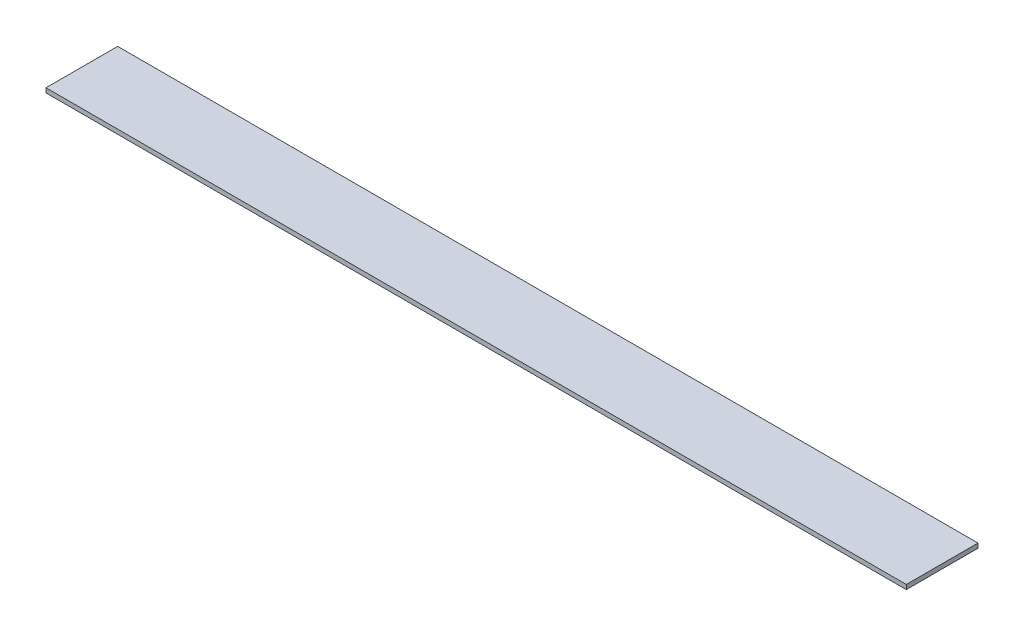
ISO-10303-21;
HEADER;
FILE_DESCRIPTION(('STEP AP214'),'2;1');
FILE_NAME('part.step','',(''),(''),'','','');
FILE_SCHEMA(('AUTOMOTIVE_DESIGN { 1 0 10303 214 1 1 1 1 }'));
ENDSEC;
DATA;
#1=APPLICATION_CONTEXT('core data for automotive mechanical design processes');
#2=APPLICATION_PROTOCOL_DEFINITION('international standard','automotive_design',2000,#1);
#3=PRODUCT_CONTEXT('',#1,'mechanical');
#4=PRODUCT('Part','Part','',(#3));
#5=PRODUCT_RELATED_PRODUCT_CATEGORY('part','',(#4));
#6=PRODUCT_DEFINITION_FORMATION('','',#4);
#7=PRODUCT_DEFINITION_CONTEXT('part definition',#1,'design');
#8=PRODUCT_DEFINITION('design','',#6,#7);
#9=PRODUCT_DEFINITION_SHAPE('','',#8);
#10=(LENGTH_UNIT() NAMED_UNIT(*) SI_UNIT(.MILLI.,.METRE.));
#11=(NAMED_UNIT(*) PLANE_ANGLE_UNIT() SI_UNIT($,.RADIAN.));
#12=(NAMED_UNIT(*) SI_UNIT($,.STERADIAN.) SOLID_ANGLE_UNIT());
#13=UNCERTAINTY_MEASURE_WITH_UNIT(LENGTH_MEASURE(1.E-05),#10,'distance_accuracy_value','');
#14=(GEOMETRIC_REPRESENTATION_CONTEXT(3) GLOBAL_UNCERTAINTY_ASSIGNED_CONTEXT((#13)) GLOBAL_UNIT_ASSIGNED_CONTEXT((#10,
#11,#12)) REPRESENTATION_CONTEXT('',''));
#15=CARTESIAN_POINT('',(0.,0.,0.));
#16=DIRECTION('',(0.,0.,1.));
#17=DIRECTION('',(1.,0.,0.));
#18=AXIS2_PLACEMENT_3D('',#15,#16,#17);
#19=CARTESIAN_POINT('',(0.,1.5875,0.));
#20=DIRECTION('',(1.,0.,0.));
#21=DIRECTION('',(0.,0.,-1.));
#22=AXIS2_PLACEMENT_3D('',#19,#20,#21);
#23=PLANE('',#22);
#24=DIRECTION('',(0.,0.,1.));
#25=VECTOR('',#24,1.);
#26=CARTESIAN_POINT('',(0.,0.,0.));
#27=LINE('',#26,#25);
#28=CARTESIAN_POINT('',(0.,0.,-25.4));
#29=VERTEX_POINT('',#28);
#30=CARTESIAN_POINT('',(0.,0.,0.));
#31=VERTEX_POINT('',#30);
#32=EDGE_CURVE('E100',#29,#31,#27,.T.);
#33=ORIENTED_EDGE('',*,*,#32,.T.);
#34=DIRECTION('',(0.,-1.,0.));
#35=VECTOR('',#34,1.);
#36=CARTESIAN_POINT('',(0.,1.5875,0.));
#37=LINE('',#36,#35);
#38=CARTESIAN_POINT('',(0.,1.5875,0.));
#39=VERTEX_POINT('',#38);
#40=EDGE_CURVE('E11',#39,#31,#37,.T.);
#41=ORIENTED_EDGE('',*,*,#40,.F.);
#42=DIRECTION('',(0.,0.,1.));
#43=VECTOR('',#42,1.);
#44=CARTESIAN_POINT('',(0.,1.5875,0.));
#45=LINE('',#44,#43);
#46=CARTESIAN_POINT('',(0.,1.5875,-25.4));
#47=VERTEX_POINT('',#46);
#48=EDGE_CURVE('E88',#47,#39,#45,.T.);
#49=ORIENTED_EDGE('',*,*,#48,.F.);
#50=DIRECTION('',(0.,-1.,0.));
#51=VECTOR('',#50,1.);
#52=CARTESIAN_POINT('',(0.,1.5875,-25.4));
#53=LINE('',#52,#51);
#54=EDGE_CURVE('E96',#47,#29,#53,.T.);
#55=ORIENTED_EDGE('',*,*,#54,.T.);
#56=EDGE_LOOP('',(#33,#41,#49,#55));
#57=FACE_BOUND('',#56,.T.);
#58=ADVANCED_FACE('F37',(#57),#23,.F.);
#59=CARTESIAN_POINT('',(0.,1.5875,0.));
#60=DIRECTION('',(0.,0.,-1.));
#61=DIRECTION('',(-1.,0.,0.));
#62=AXIS2_PLACEMENT_3D('',#59,#60,#61);
#63=PLANE('',#62);
#64=DIRECTION('',(1.,0.,0.));
#65=VECTOR('',#64,1.);
#66=CARTESIAN_POINT('',(0.,0.,0.));
#67=LINE('',#66,#65);
#68=CARTESIAN_POINT('',(304.8,0.,0.));
#69=VERTEX_POINT('',#68);
#70=EDGE_CURVE('E92',#31,#69,#67,.T.);
#71=ORIENTED_EDGE('',*,*,#70,.T.);
#72=DIRECTION('',(0.,-1.,0.));
#73=VECTOR('',#72,1.);
#74=CARTESIAN_POINT('',(304.8,1.5875,0.));
#75=LINE('',#74,#73);
#76=CARTESIAN_POINT('',(304.8,1.5875,0.));
#77=VERTEX_POINT('',#76);
#78=EDGE_CURVE('E45',#77,#69,#75,.T.);
#79=ORIENTED_EDGE('',*,*,#78,.F.);
#80=DIRECTION('',(1.,0.,0.));
#81=VECTOR('',#80,1.);
#82=CARTESIAN_POINT('',(0.,1.5875,0.));
#83=LINE('',#82,#81);
#84=EDGE_CURVE('E83',#39,#77,#83,.T.);
#85=ORIENTED_EDGE('',*,*,#84,.F.);
#86=ORIENTED_EDGE('',*,*,#40,.T.);
#87=EDGE_LOOP('',(#71,#79,#85,#86));
#88=FACE_BOUND('',#87,.T.);
#89=ADVANCED_FACE('F91',(#88),#63,.F.);
#90=CARTESIAN_POINT('',(304.8,1.5875,0.));
#91=DIRECTION('',(-1.,0.,0.));
#92=DIRECTION('',(0.,0.,1.));
#93=AXIS2_PLACEMENT_3D('',#90,#91,#92);
#94=PLANE('',#93);
#95=DIRECTION('',(0.,0.,-1.));
#96=VECTOR('',#95,1.);
#97=CARTESIAN_POINT('',(304.8,0.,0.));
#98=LINE('',#97,#96);
#99=CARTESIAN_POINT('',(304.8,0.,-25.4));
#100=VERTEX_POINT('',#99);
#101=EDGE_CURVE('E70',#69,#100,#98,.T.);
#102=ORIENTED_EDGE('',*,*,#101,.T.);
#103=DIRECTION('',(0.,-1.,0.));
#104=VECTOR('',#103,1.);
#105=CARTESIAN_POINT('',(304.8,1.5875,-25.4));
#106=LINE('',#105,#104);
#107=CARTESIAN_POINT('',(304.8,1.5875,-25.4));
#108=VERTEX_POINT('',#107);
#109=EDGE_CURVE('E93',#108,#100,#106,.T.);
#110=ORIENTED_EDGE('',*,*,#109,.F.);
#111=DIRECTION('',(0.,0.,-1.));
#112=VECTOR('',#111,1.);
#113=CARTESIAN_POINT('',(304.8,1.5875,0.));
#114=LINE('',#113,#112);
#115=EDGE_CURVE('E86',#77,#108,#114,.T.);
#116=ORIENTED_EDGE('',*,*,#115,.F.);
#117=ORIENTED_EDGE('',*,*,#78,.T.);
#118=EDGE_LOOP('',(#102,#110,#116,#117));
#119=FACE_BOUND('',#118,.T.);
#120=ADVANCED_FACE('F94',(#119),#94,.F.);
#121=CARTESIAN_POINT('',(0.,1.5875,-25.4));
#122=DIRECTION('',(0.,0.,1.));
#123=DIRECTION('',(1.,0.,0.));
#124=AXIS2_PLACEMENT_3D('',#121,#122,#123);
#125=PLANE('',#124);
#126=DIRECTION('',(-1.,0.,0.));
#127=VECTOR('',#126,1.);
#128=CARTESIAN_POINT('',(0.,0.,-25.4));
#129=LINE('',#128,#127);
#130=EDGE_CURVE('E76',#100,#29,#129,.T.);
#131=ORIENTED_EDGE('',*,*,#130,.T.);
#132=ORIENTED_EDGE('',*,*,#54,.F.);
#133=DIRECTION('',(-1.,0.,0.));
#134=VECTOR('',#133,1.);
#135=CARTESIAN_POINT('',(0.,1.5875,-25.4));
#136=LINE('',#135,#134);
#137=EDGE_CURVE('E53',#108,#47,#136,.T.);
#138=ORIENTED_EDGE('',*,*,#137,.F.);
#139=ORIENTED_EDGE('',*,*,#109,.T.);
#140=EDGE_LOOP('',(#131,#132,#138,#139));
#141=FACE_BOUND('',#140,.T.);
#142=ADVANCED_FACE('F107',(#141),#125,.F.);
#143=CARTESIAN_POINT('',(0.,1.5875,0.));
#144=DIRECTION('',(0.,-1.,0.));
#145=DIRECTION('',(0.,0.,-1.));
#146=AXIS2_PLACEMENT_3D('',#143,#144,#145);
#147=PLANE('',#146);
#148=ORIENTED_EDGE('',*,*,#48,.T.);
#149=ORIENTED_EDGE('',*,*,#84,.T.);
#150=ORIENTED_EDGE('',*,*,#115,.T.);
#151=ORIENTED_EDGE('',*,*,#137,.T.);
#152=EDGE_LOOP('',(#148,#149,#150,#151));
#153=FACE_BOUND('',#152,.T.);
#154=ADVANCED_FACE('F84',(#153),#147,.F.);
#155=CARTESIAN_POINT('',(0.,0.,0.));
#156=DIRECTION('',(0.,-1.,0.));
#157=DIRECTION('',(0.,0.,-1.));
#158=AXIS2_PLACEMENT_3D('',#155,#156,#157);
#159=PLANE('',#158);
#160=ORIENTED_EDGE('',*,*,#32,.F.);
#161=ORIENTED_EDGE('',*,*,#130,.F.);
#162=ORIENTED_EDGE('',*,*,#101,.F.);
#163=ORIENTED_EDGE('',*,*,#70,.F.);
#164=EDGE_LOOP('',(#160,#161,#162,#163));
#165=FACE_BOUND('',#164,.T.);
#166=ADVANCED_FACE('F110',(#165),#159,.T.);
#167=CLOSED_SHELL('',(#58,#89,#120,#142,#154,#166));
#168=MANIFOLD_SOLID_BREP('B2',#167);
#169=ADVANCED_BREP_SHAPE_REPRESENTATION('',(#18,#168),#14);
#170=SHAPE_DEFINITION_REPRESENTATION(#9,#169);
ENDSEC;
END-ISO-10303-21;
